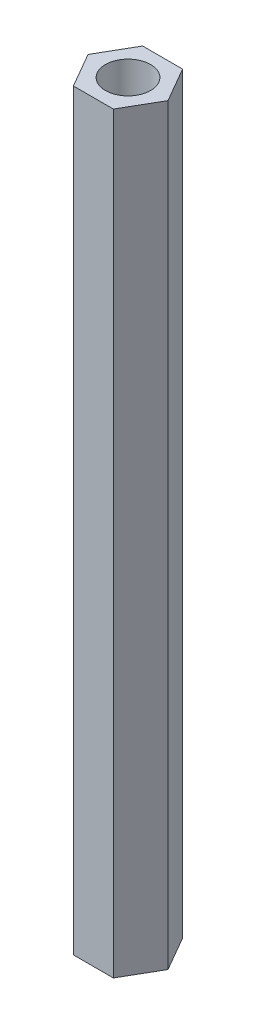
ISO-10303-21;
HEADER;
FILE_DESCRIPTION(('STEP AP214'),'2;1');
FILE_NAME('part.step','',(''),(''),'','','');
FILE_SCHEMA(('AUTOMOTIVE_DESIGN { 1 0 10303 214 1 1 1 1 }'));
ENDSEC;
DATA;
#1=APPLICATION_CONTEXT('core data for automotive mechanical design processes');
#2=APPLICATION_PROTOCOL_DEFINITION('international standard','automotive_design',2000,#1);
#3=PRODUCT_CONTEXT('',#1,'mechanical');
#4=PRODUCT('Part','Part','',(#3));
#5=PRODUCT_RELATED_PRODUCT_CATEGORY('part','',(#4));
#6=PRODUCT_DEFINITION_FORMATION('','',#4);
#7=PRODUCT_DEFINITION_CONTEXT('part definition',#1,'design');
#8=PRODUCT_DEFINITION('design','',#6,#7);
#9=PRODUCT_DEFINITION_SHAPE('','',#8);
#10=(LENGTH_UNIT() NAMED_UNIT(*) SI_UNIT(.MILLI.,.METRE.));
#11=(NAMED_UNIT(*) PLANE_ANGLE_UNIT() SI_UNIT($,.RADIAN.));
#12=(NAMED_UNIT(*) SI_UNIT($,.STERADIAN.) SOLID_ANGLE_UNIT());
#13=UNCERTAINTY_MEASURE_WITH_UNIT(LENGTH_MEASURE(1.E-05),#10,'distance_accuracy_value','');
#14=(GEOMETRIC_REPRESENTATION_CONTEXT(3) GLOBAL_UNCERTAINTY_ASSIGNED_CONTEXT((#13)) GLOBAL_UNIT_ASSIGNED_CONTEXT((#10,
#11,#12)) REPRESENTATION_CONTEXT('',''));
#15=CARTESIAN_POINT('',(0.,0.,0.));
#16=DIRECTION('',(0.,0.,1.));
#17=DIRECTION('',(1.,0.,0.));
#18=AXIS2_PLACEMENT_3D('',#15,#16,#17);
#19=CARTESIAN_POINT('',(1.32790561913614,25.,2.3));
#20=DIRECTION('',(-0.866025403784439,0.,-0.499999999999999));
#21=DIRECTION('',(-0.499999999999999,0.,0.866025403784439));
#22=AXIS2_PLACEMENT_3D('',#19,#20,#21);
#23=PLANE('',#22);
#24=DIRECTION('',(0.499999999999999,0.,-0.866025403784439));
#25=VECTOR('',#24,1.);
#26=CARTESIAN_POINT('',(1.32790561913614,-25.,2.3));
#27=LINE('',#26,#25);
#28=CARTESIAN_POINT('',(1.32790561913614,-25.,2.3));
#29=VERTEX_POINT('',#28);
#30=CARTESIAN_POINT('',(2.65581123827228,-25.,0.));
#31=VERTEX_POINT('',#30);
#32=EDGE_CURVE('E120',#29,#31,#27,.T.);
#33=ORIENTED_EDGE('',*,*,#32,.T.);
#34=DIRECTION('',(0.,-1.,0.));
#35=VECTOR('',#34,1.);
#36=CARTESIAN_POINT('',(2.65581123827228,25.,0.));
#37=LINE('',#36,#35);
#38=CARTESIAN_POINT('',(2.65581123827228,25.,0.));
#39=VERTEX_POINT('',#38);
#40=EDGE_CURVE('E11',#39,#31,#37,.T.);
#41=ORIENTED_EDGE('',*,*,#40,.F.);
#42=DIRECTION('',(0.499999999999999,0.,-0.866025403784439));
#43=VECTOR('',#42,1.);
#44=CARTESIAN_POINT('',(1.32790561913614,25.,2.3));
#45=LINE('',#44,#43);
#46=CARTESIAN_POINT('',(1.32790561913614,25.,2.3));
#47=VERTEX_POINT('',#46);
#48=EDGE_CURVE('E131',#47,#39,#45,.T.);
#49=ORIENTED_EDGE('',*,*,#48,.F.);
#50=DIRECTION('',(0.,-1.,0.));
#51=VECTOR('',#50,1.);
#52=CARTESIAN_POINT('',(1.32790561913614,25.,2.3));
#53=LINE('',#52,#51);
#54=EDGE_CURVE('E116',#47,#29,#53,.T.);
#55=ORIENTED_EDGE('',*,*,#54,.T.);
#56=EDGE_LOOP('',(#33,#41,#49,#55));
#57=FACE_BOUND('',#56,.T.);
#58=ADVANCED_FACE('F36',(#57),#23,.F.);
#59=CARTESIAN_POINT('',(2.65581123827228,25.,0.));
#60=DIRECTION('',(-0.866025403784438,0.,0.5));
#61=DIRECTION('',(0.5,0.,0.866025403784439));
#62=AXIS2_PLACEMENT_3D('',#59,#60,#61);
#63=PLANE('',#62);
#64=DIRECTION('',(-0.5,0.,-0.866025403784438));
#65=VECTOR('',#64,1.);
#66=CARTESIAN_POINT('',(2.65581123827228,-25.,0.));
#67=LINE('',#66,#65);
#68=CARTESIAN_POINT('',(1.32790561913614,-25.,-2.3));
#69=VERTEX_POINT('',#68);
#70=EDGE_CURVE('E123',#31,#69,#67,.T.);
#71=ORIENTED_EDGE('',*,*,#70,.T.);
#72=DIRECTION('',(0.,-1.,0.));
#73=VECTOR('',#72,1.);
#74=CARTESIAN_POINT('',(1.32790561913614,25.,-2.3));
#75=LINE('',#74,#73);
#76=CARTESIAN_POINT('',(1.32790561913614,25.,-2.3));
#77=VERTEX_POINT('',#76);
#78=EDGE_CURVE('E44',#77,#69,#75,.T.);
#79=ORIENTED_EDGE('',*,*,#78,.F.);
#80=DIRECTION('',(-0.5,0.,-0.866025403784438));
#81=VECTOR('',#80,1.);
#82=CARTESIAN_POINT('',(2.65581123827228,25.,0.));
#83=LINE('',#82,#81);
#84=EDGE_CURVE('E89',#39,#77,#83,.T.);
#85=ORIENTED_EDGE('',*,*,#84,.F.);
#86=ORIENTED_EDGE('',*,*,#40,.T.);
#87=EDGE_LOOP('',(#71,#79,#85,#86));
#88=FACE_BOUND('',#87,.T.);
#89=ADVANCED_FACE('F156',(#88),#63,.F.);
#90=CARTESIAN_POINT('',(1.32790561913614,25.,-2.3));
#91=DIRECTION('',(0.,0.,1.));
#92=DIRECTION('',(1.,0.,0.));
#93=AXIS2_PLACEMENT_3D('',#90,#91,#92);
#94=PLANE('',#93);
#95=DIRECTION('',(-1.,0.,0.));
#96=VECTOR('',#95,1.);
#97=CARTESIAN_POINT('',(1.32790561913614,-25.,-2.3));
#98=LINE('',#97,#96);
#99=CARTESIAN_POINT('',(-1.32790561913614,-25.,-2.3));
#100=VERTEX_POINT('',#99);
#101=EDGE_CURVE('E126',#69,#100,#98,.T.);
#102=ORIENTED_EDGE('',*,*,#101,.T.);
#103=DIRECTION('',(0.,-1.,0.));
#104=VECTOR('',#103,1.);
#105=CARTESIAN_POINT('',(-1.32790561913614,25.,-2.3));
#106=LINE('',#105,#104);
#107=CARTESIAN_POINT('',(-1.32790561913614,25.,-2.3));
#108=VERTEX_POINT('',#107);
#109=EDGE_CURVE('E111',#108,#100,#106,.T.);
#110=ORIENTED_EDGE('',*,*,#109,.F.);
#111=DIRECTION('',(-1.,0.,0.));
#112=VECTOR('',#111,1.);
#113=CARTESIAN_POINT('',(1.32790561913614,25.,-2.3));
#114=LINE('',#113,#112);
#115=EDGE_CURVE('E102',#77,#108,#114,.T.);
#116=ORIENTED_EDGE('',*,*,#115,.F.);
#117=ORIENTED_EDGE('',*,*,#78,.T.);
#118=EDGE_LOOP('',(#102,#110,#116,#117));
#119=FACE_BOUND('',#118,.T.);
#120=ADVANCED_FACE('F137',(#119),#94,.F.);
#121=CARTESIAN_POINT('',(-1.32790561913614,25.,-2.3));
#122=DIRECTION('',(0.866025403784439,0.,0.5));
#123=DIRECTION('',(0.5,0.,-0.866025403784439));
#124=AXIS2_PLACEMENT_3D('',#121,#122,#123);
#125=PLANE('',#124);
#126=DIRECTION('',(-0.5,0.,0.866025403784439));
#127=VECTOR('',#126,1.);
#128=CARTESIAN_POINT('',(-1.32790561913614,-25.,-2.3));
#129=LINE('',#128,#127);
#130=CARTESIAN_POINT('',(-2.65581123827228,-25.,0.));
#131=VERTEX_POINT('',#130);
#132=EDGE_CURVE('E110',#100,#131,#129,.T.);
#133=ORIENTED_EDGE('',*,*,#132,.T.);
#134=DIRECTION('',(0.,-1.,0.));
#135=VECTOR('',#134,1.);
#136=CARTESIAN_POINT('',(-2.65581123827228,25.,0.));
#137=LINE('',#136,#135);
#138=CARTESIAN_POINT('',(-2.65581123827228,25.,0.));
#139=VERTEX_POINT('',#138);
#140=EDGE_CURVE('E107',#139,#131,#137,.T.);
#141=ORIENTED_EDGE('',*,*,#140,.F.);
#142=DIRECTION('',(-0.5,0.,0.866025403784439));
#143=VECTOR('',#142,1.);
#144=CARTESIAN_POINT('',(-1.32790561913614,25.,-2.3));
#145=LINE('',#144,#143);
#146=EDGE_CURVE('E96',#108,#139,#145,.T.);
#147=ORIENTED_EDGE('',*,*,#146,.F.);
#148=ORIENTED_EDGE('',*,*,#109,.T.);
#149=EDGE_LOOP('',(#133,#141,#147,#148));
#150=FACE_BOUND('',#149,.T.);
#151=ADVANCED_FACE('F108',(#150),#125,.F.);
#152=CARTESIAN_POINT('',(-2.65581123827228,25.,0.));
#153=DIRECTION('',(0.866025403784438,0.,-0.5));
#154=DIRECTION('',(-0.5,0.,-0.866025403784439));
#155=AXIS2_PLACEMENT_3D('',#152,#153,#154);
#156=PLANE('',#155);
#157=DIRECTION('',(0.5,0.,0.866025403784438));
#158=VECTOR('',#157,1.);
#159=CARTESIAN_POINT('',(-2.65581123827228,-25.,0.));
#160=LINE('',#159,#158);
#161=CARTESIAN_POINT('',(-1.32790561913614,-25.,2.3));
#162=VERTEX_POINT('',#161);
#163=EDGE_CURVE('E75',#131,#162,#160,.T.);
#164=ORIENTED_EDGE('',*,*,#163,.T.);
#165=DIRECTION('',(0.,-1.,0.));
#166=VECTOR('',#165,1.);
#167=CARTESIAN_POINT('',(-1.32790561913614,25.,2.3));
#168=LINE('',#167,#166);
#169=CARTESIAN_POINT('',(-1.32790561913614,25.,2.3));
#170=VERTEX_POINT('',#169);
#171=EDGE_CURVE('E112',#170,#162,#168,.T.);
#172=ORIENTED_EDGE('',*,*,#171,.F.);
#173=DIRECTION('',(0.5,0.,0.866025403784438));
#174=VECTOR('',#173,1.);
#175=CARTESIAN_POINT('',(-2.65581123827228,25.,0.));
#176=LINE('',#175,#174);
#177=EDGE_CURVE('E100',#139,#170,#176,.T.);
#178=ORIENTED_EDGE('',*,*,#177,.F.);
#179=ORIENTED_EDGE('',*,*,#140,.T.);
#180=EDGE_LOOP('',(#164,#172,#178,#179));
#181=FACE_BOUND('',#180,.T.);
#182=ADVANCED_FACE('F114',(#181),#156,.F.);
#183=CARTESIAN_POINT('',(-1.32790561913614,25.,2.3));
#184=DIRECTION('',(0.,0.,-1.));
#185=DIRECTION('',(-1.,0.,0.));
#186=AXIS2_PLACEMENT_3D('',#183,#184,#185);
#187=PLANE('',#186);
#188=DIRECTION('',(1.,0.,0.));
#189=VECTOR('',#188,1.);
#190=CARTESIAN_POINT('',(-1.32790561913614,-25.,2.3));
#191=LINE('',#190,#189);
#192=EDGE_CURVE('E81',#162,#29,#191,.T.);
#193=ORIENTED_EDGE('',*,*,#192,.T.);
#194=ORIENTED_EDGE('',*,*,#54,.F.);
#195=DIRECTION('',(1.,0.,0.));
#196=VECTOR('',#195,1.);
#197=CARTESIAN_POINT('',(-1.32790561913614,25.,2.3));
#198=LINE('',#197,#196);
#199=EDGE_CURVE('E52',#170,#47,#198,.T.);
#200=ORIENTED_EDGE('',*,*,#199,.F.);
#201=ORIENTED_EDGE('',*,*,#171,.T.);
#202=EDGE_LOOP('',(#193,#194,#200,#201));
#203=FACE_BOUND('',#202,.T.);
#204=ADVANCED_FACE('F144',(#203),#187,.F.);
#205=CARTESIAN_POINT('',(0.,25.,0.));
#206=DIRECTION('',(0.,1.,0.));
#207=DIRECTION('',(0.,0.,1.));
#208=AXIS2_PLACEMENT_3D('',#205,#206,#207);
#209=PLANE('',#208);
#210=CARTESIAN_POINT('',(0.,25.,0.));
#211=DIRECTION('',(0.,1.,0.));
#212=DIRECTION('',(0.,0.,1.));
#213=AXIS2_PLACEMENT_3D('',#210,#211,#212);
#214=CIRCLE('',#213,1.5);
#215=CARTESIAN_POINT('',(0.,25.,1.5));
#216=VERTEX_POINT('',#215);
#217=EDGE_CURVE('E239',#216,#216,#214,.T.);
#218=ORIENTED_EDGE('',*,*,#217,.F.);
#219=EDGE_LOOP('',(#218));
#220=FACE_BOUND('',#219,.T.);
#221=ORIENTED_EDGE('',*,*,#48,.T.);
#222=ORIENTED_EDGE('',*,*,#84,.T.);
#223=ORIENTED_EDGE('',*,*,#115,.T.);
#224=ORIENTED_EDGE('',*,*,#146,.T.);
#225=ORIENTED_EDGE('',*,*,#177,.T.);
#226=ORIENTED_EDGE('',*,*,#199,.T.);
#227=EDGE_LOOP('',(#221,#222,#223,#224,#225,#226));
#228=FACE_BOUND('',#227,.T.);
#229=ADVANCED_FACE('F98',(#220,#228),#209,.T.);
#230=CARTESIAN_POINT('',(0.,-25.,0.));
#231=DIRECTION('',(0.,1.,0.));
#232=DIRECTION('',(0.,0.,1.));
#233=AXIS2_PLACEMENT_3D('',#230,#231,#232);
#234=PLANE('',#233);
#235=CARTESIAN_POINT('',(0.,-25.,0.));
#236=DIRECTION('',(0.,-1.,0.));
#237=DIRECTION('',(0.,0.,-1.));
#238=AXIS2_PLACEMENT_3D('',#235,#236,#237);
#239=CIRCLE('',#238,1.5);
#240=CARTESIAN_POINT('',(0.,-25.,-1.5));
#241=VERTEX_POINT('',#240);
#242=EDGE_CURVE('E240',#241,#241,#239,.T.);
#243=ORIENTED_EDGE('',*,*,#242,.F.);
#244=EDGE_LOOP('',(#243));
#245=FACE_BOUND('',#244,.T.);
#246=ORIENTED_EDGE('',*,*,#32,.F.);
#247=ORIENTED_EDGE('',*,*,#192,.F.);
#248=ORIENTED_EDGE('',*,*,#163,.F.);
#249=ORIENTED_EDGE('',*,*,#132,.F.);
#250=ORIENTED_EDGE('',*,*,#101,.F.);
#251=ORIENTED_EDGE('',*,*,#70,.F.);
#252=EDGE_LOOP('',(#246,#247,#248,#249,#250,#251));
#253=FACE_BOUND('',#252,.T.);
#254=ADVANCED_FACE('F140',(#245,#253),#234,.F.);
#255=CARTESIAN_POINT('',(0.,17.,0.));
#256=DIRECTION('',(0.,1.,0.));
#257=DIRECTION('',(0.,0.,1.));
#258=AXIS2_PLACEMENT_3D('',#255,#256,#257);
#259=CYLINDRICAL_SURFACE('',#258,1.5);
#260=CARTESIAN_POINT('',(0.,17.,0.));
#261=DIRECTION('',(0.,1.,0.));
#262=DIRECTION('',(0.,0.,1.));
#263=AXIS2_PLACEMENT_3D('',#260,#261,#262);
#264=CIRCLE('',#263,1.5);
#265=CARTESIAN_POINT('',(0.,17.,1.5));
#266=VERTEX_POINT('',#265);
#267=EDGE_CURVE('E124',#266,#266,#264,.T.);
#268=ORIENTED_EDGE('',*,*,#267,.F.);
#269=EDGE_LOOP('',(#268));
#270=FACE_BOUND('',#269,.T.);
#271=ORIENTED_EDGE('',*,*,#217,.T.);
#272=EDGE_LOOP('',(#271));
#273=FACE_BOUND('',#272,.T.);
#274=ADVANCED_FACE('F191',(#270,#273),#259,.F.);
#275=CARTESIAN_POINT('',(0.,17.,0.));
#276=DIRECTION('',(0.,1.,0.));
#277=DIRECTION('',(0.,0.,1.));
#278=AXIS2_PLACEMENT_3D('',#275,#276,#277);
#279=PLANE('',#278);
#280=ORIENTED_EDGE('',*,*,#267,.T.);
#281=EDGE_LOOP('',(#280));
#282=FACE_BOUND('',#281,.T.);
#283=ADVANCED_FACE('F196',(#282),#279,.T.);
#284=CARTESIAN_POINT('',(0.,-17.,0.));
#285=DIRECTION('',(0.,-1.,0.));
#286=DIRECTION('',(0.,0.,-1.));
#287=AXIS2_PLACEMENT_3D('',#284,#285,#286);
#288=CYLINDRICAL_SURFACE('',#287,1.5);
#289=CARTESIAN_POINT('',(0.,-17.,0.));
#290=DIRECTION('',(0.,-1.,0.));
#291=DIRECTION('',(0.,0.,-1.));
#292=AXIS2_PLACEMENT_3D('',#289,#290,#291);
#293=CIRCLE('',#292,1.5);
#294=CARTESIAN_POINT('',(0.,-17.,-1.5));
#295=VERTEX_POINT('',#294);
#296=EDGE_CURVE('E238',#295,#295,#293,.T.);
#297=ORIENTED_EDGE('',*,*,#296,.F.);
#298=EDGE_LOOP('',(#297));
#299=FACE_BOUND('',#298,.T.);
#300=ORIENTED_EDGE('',*,*,#242,.T.);
#301=EDGE_LOOP('',(#300));
#302=FACE_BOUND('',#301,.T.);
#303=ADVANCED_FACE('F206',(#299,#302),#288,.F.);
#304=CARTESIAN_POINT('',(0.,-17.,0.));
#305=DIRECTION('',(0.,-1.,0.));
#306=DIRECTION('',(0.,0.,-1.));
#307=AXIS2_PLACEMENT_3D('',#304,#305,#306);
#308=PLANE('',#307);
#309=ORIENTED_EDGE('',*,*,#296,.T.);
#310=EDGE_LOOP('',(#309));
#311=FACE_BOUND('',#310,.T.);
#312=ADVANCED_FACE('F222',(#311),#308,.T.);
#313=CLOSED_SHELL('',(#58,#89,#120,#151,#182,#204,#229,#254,#274,#283,#303,#312));
#314=MANIFOLD_SOLID_BREP('B2',#313);
#315=ADVANCED_BREP_SHAPE_REPRESENTATION('',(#18,#314),#14);
#316=SHAPE_DEFINITION_REPRESENTATION(#9,#315);
ENDSEC;
END-ISO-10303-21;
